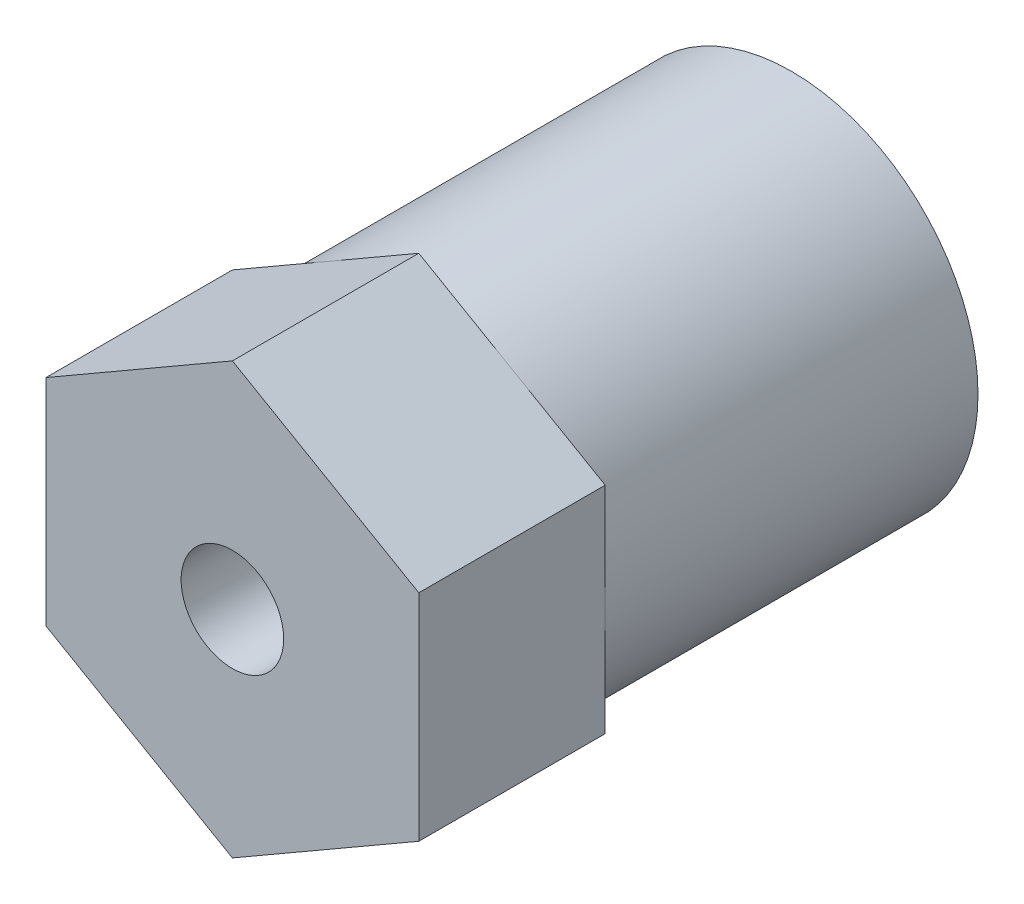
ISO-10303-21;
HEADER;
FILE_DESCRIPTION(('STEP AP214'),'2;1');
FILE_NAME('part.step','',(''),(''),'','','');
FILE_SCHEMA(('AUTOMOTIVE_DESIGN { 1 0 10303 214 1 1 1 1 }'));
ENDSEC;
DATA;
#1=APPLICATION_CONTEXT('core data for automotive mechanical design processes');
#2=APPLICATION_PROTOCOL_DEFINITION('international standard','automotive_design',2000,#1);
#3=PRODUCT_CONTEXT('',#1,'mechanical');
#4=PRODUCT('Part','Part','',(#3));
#5=PRODUCT_RELATED_PRODUCT_CATEGORY('part','',(#4));
#6=PRODUCT_DEFINITION_FORMATION('','',#4);
#7=PRODUCT_DEFINITION_CONTEXT('part definition',#1,'design');
#8=PRODUCT_DEFINITION('design','',#6,#7);
#9=PRODUCT_DEFINITION_SHAPE('','',#8);
#10=(LENGTH_UNIT() NAMED_UNIT(*) SI_UNIT(.MILLI.,.METRE.));
#11=(NAMED_UNIT(*) PLANE_ANGLE_UNIT() SI_UNIT($,.RADIAN.));
#12=(NAMED_UNIT(*) SI_UNIT($,.STERADIAN.) SOLID_ANGLE_UNIT());
#13=UNCERTAINTY_MEASURE_WITH_UNIT(LENGTH_MEASURE(1.E-05),#10,'distance_accuracy_value','');
#14=(GEOMETRIC_REPRESENTATION_CONTEXT(3) GLOBAL_UNCERTAINTY_ASSIGNED_CONTEXT((#13)) GLOBAL_UNIT_ASSIGNED_CONTEXT((#10,
#11,#12)) REPRESENTATION_CONTEXT('',''));
#15=CARTESIAN_POINT('',(0.,0.,0.));
#16=DIRECTION('',(0.,0.,1.));
#17=DIRECTION('',(1.,0.,0.));
#18=AXIS2_PLACEMENT_3D('',#15,#16,#17);
#19=CARTESIAN_POINT('',(0.,0.,-12.));
#20=DIRECTION('',(0.,0.,1.));
#21=DIRECTION('',(1.,0.,0.));
#22=AXIS2_PLACEMENT_3D('',#19,#20,#21);
#23=PLANE('',#22);
#24=CARTESIAN_POINT('',(0.,0.,-12.));
#25=DIRECTION('',(0.,0.,1.));
#26=DIRECTION('',(1.,0.,0.));
#27=AXIS2_PLACEMENT_3D('',#24,#25,#26);
#28=CIRCLE('',#27,6.);
#29=CARTESIAN_POINT('',(6.,0.,-12.));
#30=VERTEX_POINT('',#29);
#31=EDGE_CURVE('E47',#30,#30,#28,.T.);
#32=ORIENTED_EDGE('',*,*,#31,.F.);
#33=EDGE_LOOP('',(#32));
#34=FACE_BOUND('',#33,.T.);
#35=CARTESIAN_POINT('',(0.,0.,-12.));
#36=DIRECTION('',(0.,0.,1.));
#37=DIRECTION('',(1.,0.,0.));
#38=AXIS2_PLACEMENT_3D('',#35,#36,#37);
#39=CIRCLE('',#38,4.);
#40=CARTESIAN_POINT('',(4.,0.,-12.));
#41=VERTEX_POINT('',#40);
#42=EDGE_CURVE('E144',#41,#41,#39,.T.);
#43=ORIENTED_EDGE('',*,*,#42,.T.);
#44=EDGE_LOOP('',(#43));
#45=FACE_BOUND('',#44,.T.);
#46=ADVANCED_FACE('F43',(#34,#45),#23,.F.);
#47=CARTESIAN_POINT('',(0.,0.,0.));
#48=DIRECTION('',(0.,0.,-1.));
#49=DIRECTION('',(-1.,0.,0.));
#50=AXIS2_PLACEMENT_3D('',#47,#48,#49);
#51=CYLINDRICAL_SURFACE('',#50,6.);
#52=CARTESIAN_POINT('',(0.,0.,0.));
#53=DIRECTION('',(0.,0.,1.));
#54=DIRECTION('',(1.,0.,0.));
#55=AXIS2_PLACEMENT_3D('',#52,#53,#54);
#56=CIRCLE('',#55,6.);
#57=CARTESIAN_POINT('',(6.,0.,0.));
#58=VERTEX_POINT('',#57);
#59=CARTESIAN_POINT('',(3.,5.19615242270663,0.));
#60=VERTEX_POINT('',#59);
#61=EDGE_CURVE('E11',#58,#60,#56,.T.);
#62=ORIENTED_EDGE('',*,*,#61,.F.);
#63=CARTESIAN_POINT('',(3.,-5.19615242270663,0.));
#64=VERTEX_POINT('',#63);
#65=EDGE_CURVE('E53',#64,#58,#56,.T.);
#66=ORIENTED_EDGE('',*,*,#65,.F.);
#67=CARTESIAN_POINT('',(-3.,-5.19615242270663,0.));
#68=VERTEX_POINT('',#67);
#69=EDGE_CURVE('E63',#68,#64,#56,.T.);
#70=ORIENTED_EDGE('',*,*,#69,.F.);
#71=CARTESIAN_POINT('',(-6.,0.,0.));
#72=VERTEX_POINT('',#71);
#73=EDGE_CURVE('E159',#72,#68,#56,.T.);
#74=ORIENTED_EDGE('',*,*,#73,.F.);
#75=CARTESIAN_POINT('',(-3.,5.19615242270663,0.));
#76=VERTEX_POINT('',#75);
#77=EDGE_CURVE('E163',#76,#72,#56,.T.);
#78=ORIENTED_EDGE('',*,*,#77,.F.);
#79=EDGE_CURVE('E52',#60,#76,#56,.T.);
#80=ORIENTED_EDGE('',*,*,#79,.F.);
#81=EDGE_LOOP('',(#62,#66,#70,#74,#78,#80));
#82=FACE_BOUND('',#81,.T.);
#83=ORIENTED_EDGE('',*,*,#31,.T.);
#84=EDGE_LOOP('',(#83));
#85=FACE_BOUND('',#84,.T.);
#86=ADVANCED_FACE('F45',(#82,#85),#51,.T.);
#87=CARTESIAN_POINT('',(0.,0.,0.));
#88=DIRECTION('',(0.,0.,-1.));
#89=DIRECTION('',(-1.,0.,0.));
#90=AXIS2_PLACEMENT_3D('',#87,#88,#89);
#91=CYLINDRICAL_SURFACE('',#90,4.);
#92=CARTESIAN_POINT('',(0.,0.,0.));
#93=DIRECTION('',(0.,0.,1.));
#94=DIRECTION('',(1.,0.,0.));
#95=AXIS2_PLACEMENT_3D('',#92,#93,#94);
#96=CIRCLE('',#95,4.);
#97=CARTESIAN_POINT('',(4.,0.,0.));
#98=VERTEX_POINT('',#97);
#99=EDGE_CURVE('E141',#98,#98,#96,.T.);
#100=ORIENTED_EDGE('',*,*,#99,.T.);
#101=EDGE_LOOP('',(#100));
#102=FACE_BOUND('',#101,.T.);
#103=ORIENTED_EDGE('',*,*,#42,.F.);
#104=EDGE_LOOP('',(#103));
#105=FACE_BOUND('',#104,.T.);
#106=ADVANCED_FACE('F248',(#102,#105),#91,.F.);
#107=CARTESIAN_POINT('',(0.,0.,0.));
#108=DIRECTION('',(0.,0.,1.));
#109=DIRECTION('',(1.,0.,0.));
#110=AXIS2_PLACEMENT_3D('',#107,#108,#109);
#111=PLANE('',#110);
#112=DIRECTION('',(0.,1.,0.));
#113=VECTOR('',#112,1.);
#114=CARTESIAN_POINT('',(6.,-3.46410161513776,0.));
#115=LINE('',#114,#113);
#116=CARTESIAN_POINT('',(6.,3.46410161513775,0.));
#117=VERTEX_POINT('',#116);
#118=EDGE_CURVE('E139',#58,#117,#115,.T.);
#119=ORIENTED_EDGE('',*,*,#118,.F.);
#120=ORIENTED_EDGE('',*,*,#61,.T.);
#121=DIRECTION('',(-0.866025403784439,0.5,0.));
#122=VECTOR('',#121,1.);
#123=CARTESIAN_POINT('',(6.,3.46410161513775,0.));
#124=LINE('',#123,#122);
#125=EDGE_CURVE('E186',#117,#60,#124,.T.);
#126=ORIENTED_EDGE('',*,*,#125,.F.);
#127=EDGE_LOOP('',(#119,#120,#126));
#128=FACE_BOUND('',#127,.T.);
#129=ADVANCED_FACE('F251',(#128),#111,.F.);
#130=CARTESIAN_POINT('',(0.,6.92820323027551,0.));
#131=VERTEX_POINT('',#130);
#132=EDGE_CURVE('E178',#60,#131,#124,.T.);
#133=ORIENTED_EDGE('',*,*,#132,.F.);
#134=ORIENTED_EDGE('',*,*,#79,.T.);
#135=DIRECTION('',(-0.866025403784439,-0.5,0.));
#136=VECTOR('',#135,1.);
#137=CARTESIAN_POINT('',(0.,6.92820323027551,0.));
#138=LINE('',#137,#136);
#139=EDGE_CURVE('E177',#131,#76,#138,.T.);
#140=ORIENTED_EDGE('',*,*,#139,.F.);
#141=EDGE_LOOP('',(#133,#134,#140));
#142=FACE_BOUND('',#141,.T.);
#143=ADVANCED_FACE('F175',(#142),#111,.F.);
#144=CARTESIAN_POINT('',(-6.,3.46410161513775,0.));
#145=VERTEX_POINT('',#144);
#146=EDGE_CURVE('E179',#76,#145,#138,.T.);
#147=ORIENTED_EDGE('',*,*,#146,.F.);
#148=ORIENTED_EDGE('',*,*,#77,.T.);
#149=DIRECTION('',(0.,-1.,0.));
#150=VECTOR('',#149,1.);
#151=CARTESIAN_POINT('',(-6.,3.46410161513775,0.));
#152=LINE('',#151,#150);
#153=EDGE_CURVE('E182',#145,#72,#152,.T.);
#154=ORIENTED_EDGE('',*,*,#153,.F.);
#155=EDGE_LOOP('',(#147,#148,#154));
#156=FACE_BOUND('',#155,.T.);
#157=ADVANCED_FACE('F180',(#156),#111,.F.);
#158=CARTESIAN_POINT('',(-6.,-3.46410161513776,0.));
#159=VERTEX_POINT('',#158);
#160=EDGE_CURVE('E189',#72,#159,#152,.T.);
#161=ORIENTED_EDGE('',*,*,#160,.F.);
#162=ORIENTED_EDGE('',*,*,#73,.T.);
#163=DIRECTION('',(0.866025403784439,-0.5,0.));
#164=VECTOR('',#163,1.);
#165=CARTESIAN_POINT('',(-6.,-3.46410161513776,0.));
#166=LINE('',#165,#164);
#167=EDGE_CURVE('E195',#159,#68,#166,.T.);
#168=ORIENTED_EDGE('',*,*,#167,.F.);
#169=EDGE_LOOP('',(#161,#162,#168));
#170=FACE_BOUND('',#169,.T.);
#171=ADVANCED_FACE('F275',(#170),#111,.F.);
#172=CARTESIAN_POINT('',(0.,-6.92820323027551,0.));
#173=VERTEX_POINT('',#172);
#174=EDGE_CURVE('E194',#68,#173,#166,.T.);
#175=ORIENTED_EDGE('',*,*,#174,.F.);
#176=ORIENTED_EDGE('',*,*,#69,.T.);
#177=DIRECTION('',(0.866025403784439,0.5,0.));
#178=VECTOR('',#177,1.);
#179=CARTESIAN_POINT('',(0.,-6.92820323027551,0.));
#180=LINE('',#179,#178);
#181=EDGE_CURVE('E134',#173,#64,#180,.T.);
#182=ORIENTED_EDGE('',*,*,#181,.F.);
#183=EDGE_LOOP('',(#175,#176,#182));
#184=FACE_BOUND('',#183,.T.);
#185=ADVANCED_FACE('F271',(#184),#111,.F.);
#186=CARTESIAN_POINT('',(6.,-3.46410161513776,0.));
#187=VERTEX_POINT('',#186);
#188=EDGE_CURVE('E198',#64,#187,#180,.T.);
#189=ORIENTED_EDGE('',*,*,#188,.F.);
#190=ORIENTED_EDGE('',*,*,#65,.T.);
#191=EDGE_CURVE('E218',#187,#58,#115,.T.);
#192=ORIENTED_EDGE('',*,*,#191,.F.);
#193=EDGE_LOOP('',(#189,#190,#192));
#194=FACE_BOUND('',#193,.T.);
#195=ADVANCED_FACE('F266',(#194),#111,.F.);
#196=CARTESIAN_POINT('',(0.,0.,6.));
#197=DIRECTION('',(0.,0.,1.));
#198=DIRECTION('',(1.,0.,0.));
#199=AXIS2_PLACEMENT_3D('',#196,#197,#198);
#200=PLANE('',#199);
#201=DIRECTION('',(0.,1.,0.));
#202=VECTOR('',#201,1.);
#203=CARTESIAN_POINT('',(6.,-3.46410161513776,6.));
#204=LINE('',#203,#202);
#205=CARTESIAN_POINT('',(6.,-3.46410161513776,6.));
#206=VERTEX_POINT('',#205);
#207=CARTESIAN_POINT('',(6.,3.46410161513775,6.));
#208=VERTEX_POINT('',#207);
#209=EDGE_CURVE('E124',#206,#208,#204,.T.);
#210=ORIENTED_EDGE('',*,*,#209,.T.);
#211=DIRECTION('',(-0.866025403784439,0.5,0.));
#212=VECTOR('',#211,1.);
#213=CARTESIAN_POINT('',(6.,3.46410161513775,6.));
#214=LINE('',#213,#212);
#215=CARTESIAN_POINT('',(0.,6.92820323027551,6.));
#216=VERTEX_POINT('',#215);
#217=EDGE_CURVE('E113',#208,#216,#214,.T.);
#218=ORIENTED_EDGE('',*,*,#217,.T.);
#219=DIRECTION('',(-0.866025403784439,-0.5,0.));
#220=VECTOR('',#219,1.);
#221=CARTESIAN_POINT('',(0.,6.92820323027551,6.));
#222=LINE('',#221,#220);
#223=CARTESIAN_POINT('',(-6.,3.46410161513775,6.));
#224=VERTEX_POINT('',#223);
#225=EDGE_CURVE('E123',#216,#224,#222,.T.);
#226=ORIENTED_EDGE('',*,*,#225,.T.);
#227=DIRECTION('',(0.,-1.,0.));
#228=VECTOR('',#227,1.);
#229=CARTESIAN_POINT('',(-6.,3.46410161513775,6.));
#230=LINE('',#229,#228);
#231=CARTESIAN_POINT('',(-6.,-3.46410161513776,6.));
#232=VERTEX_POINT('',#231);
#233=EDGE_CURVE('E212',#224,#232,#230,.T.);
#234=ORIENTED_EDGE('',*,*,#233,.T.);
#235=DIRECTION('',(0.866025403784439,-0.5,0.));
#236=VECTOR('',#235,1.);
#237=CARTESIAN_POINT('',(-6.,-3.46410161513776,6.));
#238=LINE('',#237,#236);
#239=CARTESIAN_POINT('',(0.,-6.92820323027551,6.));
#240=VERTEX_POINT('',#239);
#241=EDGE_CURVE('E214',#232,#240,#238,.T.);
#242=ORIENTED_EDGE('',*,*,#241,.T.);
#243=DIRECTION('',(0.866025403784439,0.5,0.));
#244=VECTOR('',#243,1.);
#245=CARTESIAN_POINT('',(0.,-6.92820323027551,6.));
#246=LINE('',#245,#244);
#247=EDGE_CURVE('E130',#240,#206,#246,.T.);
#248=ORIENTED_EDGE('',*,*,#247,.T.);
#249=EDGE_LOOP('',(#210,#218,#226,#234,#242,#248));
#250=FACE_BOUND('',#249,.T.);
#251=CARTESIAN_POINT('',(0.,0.,6.));
#252=DIRECTION('',(0.,0.,1.));
#253=DIRECTION('',(1.,0.,0.));
#254=AXIS2_PLACEMENT_3D('',#251,#252,#253);
#255=CIRCLE('',#254,1.65);
#256=CARTESIAN_POINT('',(1.65,0.,6.));
#257=VERTEX_POINT('',#256);
#258=EDGE_CURVE('E219',#257,#257,#255,.T.);
#259=ORIENTED_EDGE('',*,*,#258,.F.);
#260=EDGE_LOOP('',(#259));
#261=FACE_BOUND('',#260,.T.);
#262=ADVANCED_FACE('F127',(#250,#261),#200,.T.);
#263=ORIENTED_EDGE('',*,*,#99,.F.);
#264=EDGE_LOOP('',(#263));
#265=FACE_BOUND('',#264,.T.);
#266=CARTESIAN_POINT('',(0.,0.,0.));
#267=DIRECTION('',(0.,0.,1.));
#268=DIRECTION('',(1.,0.,0.));
#269=AXIS2_PLACEMENT_3D('',#266,#267,#268);
#270=CIRCLE('',#269,1.65);
#271=CARTESIAN_POINT('',(1.65,0.,0.));
#272=VERTEX_POINT('',#271);
#273=EDGE_CURVE('E221',#272,#272,#270,.T.);
#274=ORIENTED_EDGE('',*,*,#273,.T.);
#275=EDGE_LOOP('',(#274));
#276=FACE_BOUND('',#275,.T.);
#277=ADVANCED_FACE('F229',(#265,#276),#111,.F.);
#278=CARTESIAN_POINT('',(6.,-3.46410161513776,6.));
#279=DIRECTION('',(-1.,0.,0.));
#280=DIRECTION('',(0.,-1.,0.));
#281=AXIS2_PLACEMENT_3D('',#278,#279,#280);
#282=PLANE('',#281);
#283=ORIENTED_EDGE('',*,*,#191,.T.);
#284=ORIENTED_EDGE('',*,*,#118,.T.);
#285=DIRECTION('',(0.,0.,-1.));
#286=VECTOR('',#285,1.);
#287=CARTESIAN_POINT('',(6.,3.46410161513775,6.));
#288=LINE('',#287,#286);
#289=EDGE_CURVE('E118',#208,#117,#288,.T.);
#290=ORIENTED_EDGE('',*,*,#289,.F.);
#291=ORIENTED_EDGE('',*,*,#209,.F.);
#292=DIRECTION('',(0.,0.,-1.));
#293=VECTOR('',#292,1.);
#294=CARTESIAN_POINT('',(6.,-3.46410161513776,6.));
#295=LINE('',#294,#293);
#296=EDGE_CURVE('E201',#206,#187,#295,.T.);
#297=ORIENTED_EDGE('',*,*,#296,.T.);
#298=EDGE_LOOP('',(#283,#284,#290,#291,#297));
#299=FACE_BOUND('',#298,.T.);
#300=ADVANCED_FACE('F137',(#299),#282,.F.);
#301=CARTESIAN_POINT('',(6.,3.46410161513775,6.));
#302=DIRECTION('',(-0.5,-0.866025403784439,0.));
#303=DIRECTION('',(0.866025403784439,-0.5,0.));
#304=AXIS2_PLACEMENT_3D('',#301,#302,#303);
#305=PLANE('',#304);
#306=ORIENTED_EDGE('',*,*,#125,.T.);
#307=ORIENTED_EDGE('',*,*,#132,.T.);
#308=DIRECTION('',(0.,0.,-1.));
#309=VECTOR('',#308,1.);
#310=CARTESIAN_POINT('',(0.,6.92820323027551,6.));
#311=LINE('',#310,#309);
#312=EDGE_CURVE('E120',#216,#131,#311,.T.);
#313=ORIENTED_EDGE('',*,*,#312,.F.);
#314=ORIENTED_EDGE('',*,*,#217,.F.);
#315=ORIENTED_EDGE('',*,*,#289,.T.);
#316=EDGE_LOOP('',(#306,#307,#313,#314,#315));
#317=FACE_BOUND('',#316,.T.);
#318=ADVANCED_FACE('F116',(#317),#305,.F.);
#319=CARTESIAN_POINT('',(0.,6.92820323027551,6.));
#320=DIRECTION('',(0.5,-0.866025403784439,0.));
#321=DIRECTION('',(0.866025403784439,0.5,0.));
#322=AXIS2_PLACEMENT_3D('',#319,#320,#321);
#323=PLANE('',#322);
#324=ORIENTED_EDGE('',*,*,#139,.T.);
#325=ORIENTED_EDGE('',*,*,#146,.T.);
#326=DIRECTION('',(0.,0.,-1.));
#327=VECTOR('',#326,1.);
#328=CARTESIAN_POINT('',(-6.,3.46410161513775,6.));
#329=LINE('',#328,#327);
#330=EDGE_CURVE('E146',#224,#145,#329,.T.);
#331=ORIENTED_EDGE('',*,*,#330,.F.);
#332=ORIENTED_EDGE('',*,*,#225,.F.);
#333=ORIENTED_EDGE('',*,*,#312,.T.);
#334=EDGE_LOOP('',(#324,#325,#331,#332,#333));
#335=FACE_BOUND('',#334,.T.);
#336=ADVANCED_FACE('F188',(#335),#323,.F.);
#337=CARTESIAN_POINT('',(-6.,3.46410161513775,6.));
#338=DIRECTION('',(1.,0.,0.));
#339=DIRECTION('',(0.,1.,0.));
#340=AXIS2_PLACEMENT_3D('',#337,#338,#339);
#341=PLANE('',#340);
#342=ORIENTED_EDGE('',*,*,#153,.T.);
#343=ORIENTED_EDGE('',*,*,#160,.T.);
#344=DIRECTION('',(0.,0.,-1.));
#345=VECTOR('',#344,1.);
#346=CARTESIAN_POINT('',(-6.,-3.46410161513776,6.));
#347=LINE('',#346,#345);
#348=EDGE_CURVE('E206',#232,#159,#347,.T.);
#349=ORIENTED_EDGE('',*,*,#348,.F.);
#350=ORIENTED_EDGE('',*,*,#233,.F.);
#351=ORIENTED_EDGE('',*,*,#330,.T.);
#352=EDGE_LOOP('',(#342,#343,#349,#350,#351));
#353=FACE_BOUND('',#352,.T.);
#354=ADVANCED_FACE('F210',(#353),#341,.F.);
#355=CARTESIAN_POINT('',(-6.,-3.46410161513776,6.));
#356=DIRECTION('',(0.5,0.866025403784439,0.));
#357=DIRECTION('',(-0.866025403784439,0.5,0.));
#358=AXIS2_PLACEMENT_3D('',#355,#356,#357);
#359=PLANE('',#358);
#360=ORIENTED_EDGE('',*,*,#167,.T.);
#361=ORIENTED_EDGE('',*,*,#174,.T.);
#362=DIRECTION('',(0.,0.,-1.));
#363=VECTOR('',#362,1.);
#364=CARTESIAN_POINT('',(0.,-6.92820323027551,6.));
#365=LINE('',#364,#363);
#366=EDGE_CURVE('E203',#240,#173,#365,.T.);
#367=ORIENTED_EDGE('',*,*,#366,.F.);
#368=ORIENTED_EDGE('',*,*,#241,.F.);
#369=ORIENTED_EDGE('',*,*,#348,.T.);
#370=EDGE_LOOP('',(#360,#361,#367,#368,#369));
#371=FACE_BOUND('',#370,.T.);
#372=ADVANCED_FACE('F238',(#371),#359,.F.);
#373=CARTESIAN_POINT('',(0.,-6.92820323027551,6.));
#374=DIRECTION('',(-0.5,0.866025403784439,0.));
#375=DIRECTION('',(-0.866025403784439,-0.5,0.));
#376=AXIS2_PLACEMENT_3D('',#373,#374,#375);
#377=PLANE('',#376);
#378=ORIENTED_EDGE('',*,*,#181,.T.);
#379=ORIENTED_EDGE('',*,*,#188,.T.);
#380=ORIENTED_EDGE('',*,*,#296,.F.);
#381=ORIENTED_EDGE('',*,*,#247,.F.);
#382=ORIENTED_EDGE('',*,*,#366,.T.);
#383=EDGE_LOOP('',(#378,#379,#380,#381,#382));
#384=FACE_BOUND('',#383,.T.);
#385=ADVANCED_FACE('F233',(#384),#377,.F.);
#386=CARTESIAN_POINT('',(0.,0.,6.));
#387=DIRECTION('',(0.,0.,-1.));
#388=DIRECTION('',(-1.,0.,0.));
#389=AXIS2_PLACEMENT_3D('',#386,#387,#388);
#390=CYLINDRICAL_SURFACE('',#389,1.65);
#391=ORIENTED_EDGE('',*,*,#258,.T.);
#392=EDGE_LOOP('',(#391));
#393=FACE_BOUND('',#392,.T.);
#394=ORIENTED_EDGE('',*,*,#273,.F.);
#395=EDGE_LOOP('',(#394));
#396=FACE_BOUND('',#395,.T.);
#397=ADVANCED_FACE('F231',(#393,#396),#390,.F.);
#398=CLOSED_SHELL('',(#46,#86,#106,#129,#143,#157,#171,#185,#195,#262,#277,#300,#318,#336,#354,
#372,#385,#397));
#399=MANIFOLD_SOLID_BREP('B2',#398);
#400=ADVANCED_BREP_SHAPE_REPRESENTATION('',(#18,#399),#14);
#401=SHAPE_DEFINITION_REPRESENTATION(#9,#400);
ENDSEC;
END-ISO-10303-21;
